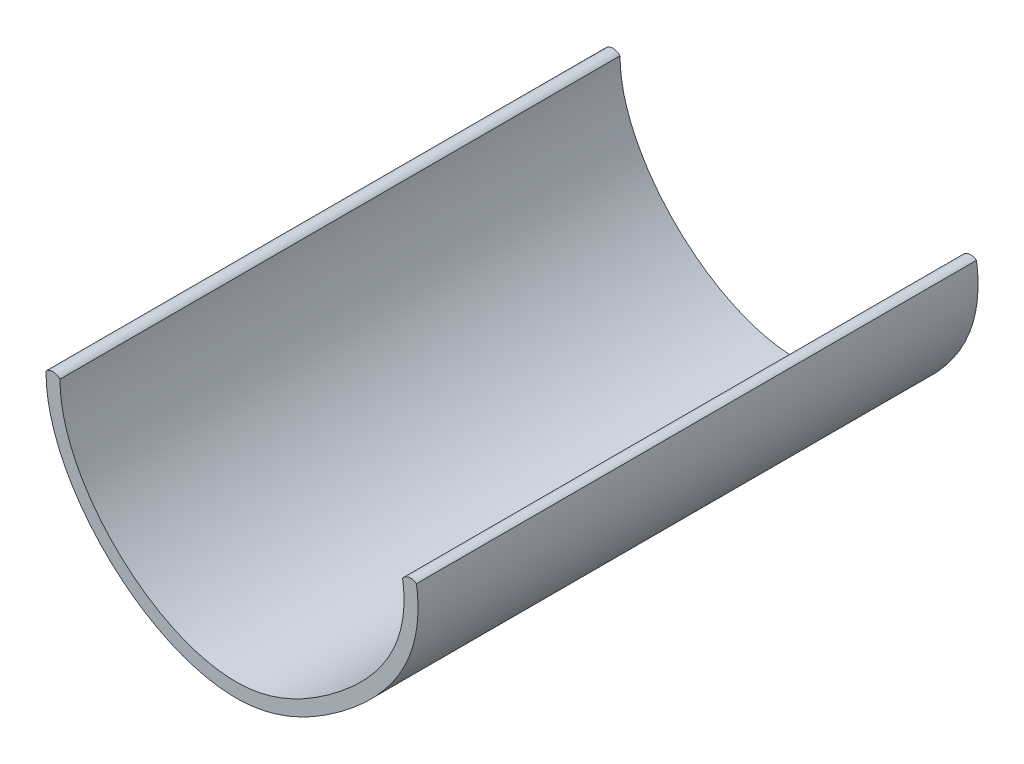
ISO-10303-21;
HEADER;
FILE_DESCRIPTION(('STEP AP214'),'2;1');
FILE_NAME('part.step','',(''),(''),'','','');
FILE_SCHEMA(('AUTOMOTIVE_DESIGN { 1 0 10303 214 1 1 1 1 }'));
ENDSEC;
DATA;
#1=APPLICATION_CONTEXT('core data for automotive mechanical design processes');
#2=APPLICATION_PROTOCOL_DEFINITION('international standard','automotive_design',2000,#1);
#3=PRODUCT_CONTEXT('',#1,'mechanical');
#4=PRODUCT('Part','Part','',(#3));
#5=PRODUCT_RELATED_PRODUCT_CATEGORY('part','',(#4));
#6=PRODUCT_DEFINITION_FORMATION('','',#4);
#7=PRODUCT_DEFINITION_CONTEXT('part definition',#1,'design');
#8=PRODUCT_DEFINITION('design','',#6,#7);
#9=PRODUCT_DEFINITION_SHAPE('','',#8);
#10=(LENGTH_UNIT() NAMED_UNIT(*) SI_UNIT(.MILLI.,.METRE.));
#11=(NAMED_UNIT(*) PLANE_ANGLE_UNIT() SI_UNIT($,.RADIAN.));
#12=(NAMED_UNIT(*) SI_UNIT($,.STERADIAN.) SOLID_ANGLE_UNIT());
#13=UNCERTAINTY_MEASURE_WITH_UNIT(LENGTH_MEASURE(1.E-05),#10,'distance_accuracy_value','');
#14=(GEOMETRIC_REPRESENTATION_CONTEXT(3) GLOBAL_UNCERTAINTY_ASSIGNED_CONTEXT((#13)) GLOBAL_UNIT_ASSIGNED_CONTEXT((#10,
#11,#12)) REPRESENTATION_CONTEXT('',''));
#15=CARTESIAN_POINT('',(0.,0.,0.));
#16=DIRECTION('',(0.,0.,1.));
#17=DIRECTION('',(1.,0.,0.));
#18=AXIS2_PLACEMENT_3D('',#15,#16,#17);
#19=CARTESIAN_POINT('',(-53.9458792130575,0.0161390405231305,160.));
#20=CARTESIAN_POINT('',(-53.9728372771176,-3.32447916920619,160.));
#21=CARTESIAN_POINT('',(-53.1169197391425,-9.97210813956946,160.));
#22=CARTESIAN_POINT('',(-48.3186257412113,-22.9476999731037,160.));
#23=CARTESIAN_POINT('',(-37.4977810954608,-37.6557960795774,160.));
#24=CARTESIAN_POINT('',(-22.5369827321518,-48.2889658051953,160.));
#25=CARTESIAN_POINT('',(-9.35297820489991,-52.9780975265847,160.));
#26=CARTESIAN_POINT('',(-0.875167080412836,-54.0072326889111,160.));
#27=CARTESIAN_POINT('',(5.88420344258249,-53.4737669759108,160.));
#28=CARTESIAN_POINT('',(12.495566088701,-52.0193173768353,160.));
#29=CARTESIAN_POINT('',(20.412937664188,-48.750122664442,160.));
#30=CARTESIAN_POINT('',(29.2163138320214,-43.1744173587522,160.));
#31=CARTESIAN_POINT('',(37.2556199118436,-36.6657466850767,160.));
#32=CARTESIAN_POINT('',(44.2264496344875,-29.1983564609291,160.));
#33=CARTESIAN_POINT('',(48.6223971087403,-22.0474809606801,160.));
#34=CARTESIAN_POINT('',(50.9830227572088,-15.7278012700219,160.));
#35=CARTESIAN_POINT('',(52.0925349916324,-10.6910470314013,160.));
#36=CARTESIAN_POINT('',(52.4010363149379,-6.2431917660797,160.));
#37=CARTESIAN_POINT('',(52.2468069212184,-2.55989558369466,160.));
#38=CARTESIAN_POINT('',(52.0257770110246,-0.643260947069359,160.));
#39=CARTESIAN_POINT('',(51.883290662586,0.299026980879101,160.));
#40=B_SPLINE_CURVE_WITH_KNOTS('',3,(#19,#20,#21,#22,#23,#24,#25,#26,#27,#28,#29,#30,#31,#32,#33,
#34,#35,#36,#37,#38,#39),.UNSPECIFIED.,.F.,.F.,(4,1,1,1,1,1,1,1,1,1,1,1,1,1,1,1,1,1,4),(0.,
0.0625,0.125,0.25,0.375,0.4375,0.5,0.53125,0.5625,0.625,0.6875,0.75,0.8125,0.875,0.90625,0.9375,
0.96875,0.984375,1.),.UNSPECIFIED.);
#41=DIRECTION('',(0.,0.,-1.));
#42=VECTOR('',#41,1.);
#43=SURFACE_OF_LINEAR_EXTRUSION('',#40,#42);
#44=CARTESIAN_POINT('',(-53.9458792130575,0.0161390405231305,0.));
#45=CARTESIAN_POINT('',(-53.9728372771176,-3.32447916920619,0.));
#46=CARTESIAN_POINT('',(-53.1169197391425,-9.97210813956946,0.));
#47=CARTESIAN_POINT('',(-48.3186257412113,-22.9476999731037,0.));
#48=CARTESIAN_POINT('',(-37.4977810954608,-37.6557960795774,0.));
#49=CARTESIAN_POINT('',(-22.5369827321518,-48.2889658051953,0.));
#50=CARTESIAN_POINT('',(-9.35297820489991,-52.9780975265847,0.));
#51=CARTESIAN_POINT('',(-0.875167080412836,-54.0072326889111,0.));
#52=CARTESIAN_POINT('',(5.88420344258249,-53.4737669759108,0.));
#53=CARTESIAN_POINT('',(12.495566088701,-52.0193173768353,0.));
#54=CARTESIAN_POINT('',(20.412937664188,-48.750122664442,0.));
#55=CARTESIAN_POINT('',(29.2163138320214,-43.1744173587522,0.));
#56=CARTESIAN_POINT('',(37.2556199118436,-36.6657466850767,0.));
#57=CARTESIAN_POINT('',(44.2264496344875,-29.1983564609291,0.));
#58=CARTESIAN_POINT('',(48.6223971087403,-22.0474809606801,0.));
#59=CARTESIAN_POINT('',(50.9830227572088,-15.7278012700219,0.));
#60=CARTESIAN_POINT('',(52.0925349916324,-10.6910470314013,0.));
#61=CARTESIAN_POINT('',(52.4010363149379,-6.2431917660797,0.));
#62=CARTESIAN_POINT('',(52.2468069212184,-2.55989558369466,0.));
#63=CARTESIAN_POINT('',(52.0257770110246,-0.643260947069359,0.));
#64=CARTESIAN_POINT('',(51.883290662586,0.299026980879101,0.));
#65=B_SPLINE_CURVE_WITH_KNOTS('',3,(#44,#45,#46,#47,#48,#49,#50,#51,#52,#53,#54,#55,#56,#57,#58,
#59,#60,#61,#62,#63,#64),.UNSPECIFIED.,.F.,.F.,(4,1,1,1,1,1,1,1,1,1,1,1,1,1,1,1,1,1,4),(0.,
0.0625,0.125,0.25,0.375,0.4375,0.5,0.53125,0.5625,0.625,0.6875,0.75,0.8125,0.875,0.90625,0.9375,
0.96875,0.984375,1.),.UNSPECIFIED.);
#66=CARTESIAN_POINT('',(-53.9458792130575,0.0161390405231318,0.));
#67=VERTEX_POINT('',#66);
#68=CARTESIAN_POINT('',(51.883290662586,0.2990269808791,0.));
#69=VERTEX_POINT('',#68);
#70=EDGE_CURVE('E116',#67,#69,#65,.T.);
#71=ORIENTED_EDGE('',*,*,#70,.T.);
#72=DIRECTION('',(0.,0.,-1.));
#73=VECTOR('',#72,1.);
#74=CARTESIAN_POINT('',(51.883290662586,0.2990269808791,160.));
#75=LINE('',#74,#73);
#76=CARTESIAN_POINT('',(51.883290662586,0.2990269808791,160.));
#77=VERTEX_POINT('',#76);
#78=EDGE_CURVE('E11',#77,#69,#75,.T.);
#79=ORIENTED_EDGE('',*,*,#78,.F.);
#80=CARTESIAN_POINT('',(-53.9458792130575,0.0161390405231318,160.));
#81=VERTEX_POINT('',#80);
#82=EDGE_CURVE('E85',#81,#77,#40,.T.);
#83=ORIENTED_EDGE('',*,*,#82,.F.);
#84=DIRECTION('',(0.,0.,-1.));
#85=VECTOR('',#84,1.);
#86=CARTESIAN_POINT('',(-53.9458792130575,0.0161390405231318,160.));
#87=LINE('',#86,#85);
#88=EDGE_CURVE('E93',#81,#67,#87,.T.);
#89=ORIENTED_EDGE('',*,*,#88,.T.);
#90=EDGE_LOOP('',(#71,#79,#83,#89));
#91=FACE_BOUND('',#90,.T.);
#92=ADVANCED_FACE('F33',(#91),#43,.F.);
#93=CARTESIAN_POINT('',(50.2047982719529,-1.97751937151229,160.));
#94=DIRECTION('',(0.,0.,-1.));
#95=DIRECTION('',(-1.,0.,0.));
#96=AXIS2_PLACEMENT_3D('',#93,#94,#95);
#97=CYLINDRICAL_SURFACE('',#96,2.8284271247462);
#98=CARTESIAN_POINT('',(50.2047982719529,-1.97751937151229,0.));
#99=DIRECTION('',(0.,0.,1.));
#100=DIRECTION('',(1.,0.,0.));
#101=AXIS2_PLACEMENT_3D('',#98,#99,#100);
#102=CIRCLE('',#101,2.8284271247462);
#103=CARTESIAN_POINT('',(47.9282519195615,-0.2990269808791,0.));
#104=VERTEX_POINT('',#103);
#105=EDGE_CURVE('E89',#69,#104,#102,.T.);
#106=ORIENTED_EDGE('',*,*,#105,.T.);
#107=DIRECTION('',(0.,0.,-1.));
#108=VECTOR('',#107,1.);
#109=CARTESIAN_POINT('',(47.9282519195615,-0.2990269808791,160.));
#110=LINE('',#109,#108);
#111=CARTESIAN_POINT('',(47.9282519195615,-0.2990269808791,160.));
#112=VERTEX_POINT('',#111);
#113=EDGE_CURVE('E42',#112,#104,#110,.T.);
#114=ORIENTED_EDGE('',*,*,#113,.F.);
#115=CARTESIAN_POINT('',(50.2047982719529,-1.97751937151229,160.));
#116=DIRECTION('',(0.,0.,1.));
#117=DIRECTION('',(1.,0.,0.));
#118=AXIS2_PLACEMENT_3D('',#115,#116,#117);
#119=CIRCLE('',#118,2.8284271247462);
#120=EDGE_CURVE('E80',#77,#112,#119,.T.);
#121=ORIENTED_EDGE('',*,*,#120,.F.);
#122=ORIENTED_EDGE('',*,*,#78,.T.);
#123=EDGE_LOOP('',(#106,#114,#121,#122));
#124=FACE_BOUND('',#123,.T.);
#125=ADVANCED_FACE('F88',(#124),#97,.T.);
#126=CARTESIAN_POINT('',(47.9282519195615,-0.299026980879101,160.));
#127=CARTESIAN_POINT('',(48.0565380332933,-1.14740619487159,160.));
#128=CARTESIAN_POINT('',(48.255945865111,-2.87692506175413,160.));
#129=CARTESIAN_POINT('',(48.3931920867555,-6.16966804369663,160.));
#130=CARTESIAN_POINT('',(48.1184819172362,-10.1214914860022,160.));
#131=CARTESIAN_POINT('',(47.134803167472,-14.5879541962331,160.));
#132=CARTESIAN_POINT('',(45.0312256620008,-20.2257942748311,160.));
#133=CARTESIAN_POINT('',(41.0485006582265,-26.7249619131409,160.));
#134=CARTESIAN_POINT('',(34.5570033027371,-33.6975870077957,160.));
#135=CARTESIAN_POINT('',(26.8551275261533,-39.9359843201061,160.));
#136=CARTESIAN_POINT('',(18.528840903893,-45.1981754956068,160.));
#137=CARTESIAN_POINT('',(9.76451809995502,-48.8119913495424,160.));
#138=CARTESIAN_POINT('',(0.809088458335742,-50.1740477135519,160.));
#139=CARTESIAN_POINT('',(-8.39784542531392,-49.0581878681569,160.));
#140=CARTESIAN_POINT('',(-20.5646312113137,-44.7473293016711,160.));
#141=CARTESIAN_POINT('',(-31.8337528340813,-36.7569005397196,160.));
#142=CARTESIAN_POINT('',(-40.7466676635166,-26.4535588780411,160.));
#143=CARTESIAN_POINT('',(-45.9062438897834,-17.9296627917126,160.));
#144=CARTESIAN_POINT('',(-48.6577771361517,-10.4759940056276,160.));
#145=CARTESIAN_POINT('',(-49.7794457909959,-4.47117694600204,160.));
#146=CARTESIAN_POINT('',(-49.9580390699342,-1.50683841029244,160.));
#147=CARTESIAN_POINT('',(-49.9460094494922,-0.0161390405231305,160.));
#148=B_SPLINE_CURVE_WITH_KNOTS('',3,(#126,#127,#128,#129,#130,#131,#132,#133,#134,#135,#136,
#137,#138,#139,#140,#141,#142,#143,#144,#145,#146,#147),.UNSPECIFIED.,.F.,.F.,(4,1,1,1,1,1,1,1,
1,1,1,1,1,1,1,1,1,1,1,4),(0.,0.015625,0.03125,0.0625,0.09375,0.125,0.1875,0.25,0.3125,0.375,
0.4375,0.5,0.5625,0.625,0.75,0.8125,0.875,0.9375,0.96875,1.),.UNSPECIFIED.);
#149=DIRECTION('',(0.,0.,-1.));
#150=VECTOR('',#149,1.);
#151=SURFACE_OF_LINEAR_EXTRUSION('',#148,#150);
#152=CARTESIAN_POINT('',(47.9282519195615,-0.299026980879101,0.));
#153=CARTESIAN_POINT('',(48.0565380332933,-1.14740619487159,0.));
#154=CARTESIAN_POINT('',(48.255945865111,-2.87692506175413,0.));
#155=CARTESIAN_POINT('',(48.3931920867555,-6.16966804369663,0.));
#156=CARTESIAN_POINT('',(48.1184819172362,-10.1214914860022,0.));
#157=CARTESIAN_POINT('',(47.134803167472,-14.5879541962331,0.));
#158=CARTESIAN_POINT('',(45.0312256620008,-20.2257942748311,0.));
#159=CARTESIAN_POINT('',(41.0485006582265,-26.7249619131409,0.));
#160=CARTESIAN_POINT('',(34.5570033027371,-33.6975870077957,0.));
#161=CARTESIAN_POINT('',(26.8551275261533,-39.9359843201061,0.));
#162=CARTESIAN_POINT('',(18.528840903893,-45.1981754956068,0.));
#163=CARTESIAN_POINT('',(9.76451809995502,-48.8119913495424,0.));
#164=CARTESIAN_POINT('',(0.809088458335742,-50.1740477135519,0.));
#165=CARTESIAN_POINT('',(-8.39784542531392,-49.0581878681569,0.));
#166=CARTESIAN_POINT('',(-20.5646312113137,-44.7473293016711,0.));
#167=CARTESIAN_POINT('',(-31.8337528340813,-36.7569005397196,0.));
#168=CARTESIAN_POINT('',(-40.7466676635166,-26.4535588780411,0.));
#169=CARTESIAN_POINT('',(-45.9062438897834,-17.9296627917126,0.));
#170=CARTESIAN_POINT('',(-48.6577771361517,-10.4759940056276,0.));
#171=CARTESIAN_POINT('',(-49.7794457909959,-4.47117694600204,0.));
#172=CARTESIAN_POINT('',(-49.9580390699342,-1.50683841029244,0.));
#173=CARTESIAN_POINT('',(-49.9460094494922,-0.0161390405231305,0.));
#174=B_SPLINE_CURVE_WITH_KNOTS('',3,(#152,#153,#154,#155,#156,#157,#158,#159,#160,#161,#162,
#163,#164,#165,#166,#167,#168,#169,#170,#171,#172,#173),.UNSPECIFIED.,.F.,.F.,(4,1,1,1,1,1,1,1,
1,1,1,1,1,1,1,1,1,1,1,4),(0.,0.015625,0.03125,0.0625,0.09375,0.125,0.1875,0.25,0.3125,0.375,
0.4375,0.5,0.5625,0.625,0.75,0.8125,0.875,0.9375,0.96875,1.),.UNSPECIFIED.);
#175=CARTESIAN_POINT('',(-49.9460094494922,-0.0161390405231305,0.));
#176=VERTEX_POINT('',#175);
#177=EDGE_CURVE('E67',#104,#176,#174,.T.);
#178=ORIENTED_EDGE('',*,*,#177,.T.);
#179=DIRECTION('',(0.,0.,-1.));
#180=VECTOR('',#179,1.);
#181=CARTESIAN_POINT('',(-49.9460094494922,-0.0161390405231305,160.));
#182=LINE('',#181,#180);
#183=CARTESIAN_POINT('',(-49.9460094494922,-0.0161390405231305,160.));
#184=VERTEX_POINT('',#183);
#185=EDGE_CURVE('E90',#184,#176,#182,.T.);
#186=ORIENTED_EDGE('',*,*,#185,.F.);
#187=EDGE_CURVE('E83',#112,#184,#148,.T.);
#188=ORIENTED_EDGE('',*,*,#187,.F.);
#189=ORIENTED_EDGE('',*,*,#113,.T.);
#190=EDGE_LOOP('',(#178,#186,#188,#189));
#191=FACE_BOUND('',#190,.T.);
#192=ADVANCED_FACE('F91',(#191),#151,.F.);
#193=CARTESIAN_POINT('',(-51.962083371798,-1.99993488178267,160.));
#194=DIRECTION('',(0.,0.,-1.));
#195=DIRECTION('',(-1.,0.,0.));
#196=AXIS2_PLACEMENT_3D('',#193,#194,#195);
#197=CYLINDRICAL_SURFACE('',#196,2.8284271247462);
#198=CARTESIAN_POINT('',(-51.962083371798,-1.99993488178267,0.));
#199=DIRECTION('',(0.,0.,1.));
#200=DIRECTION('',(1.,0.,0.));
#201=AXIS2_PLACEMENT_3D('',#198,#199,#200);
#202=CIRCLE('',#201,2.8284271247462);
#203=EDGE_CURVE('E73',#176,#67,#202,.T.);
#204=ORIENTED_EDGE('',*,*,#203,.T.);
#205=ORIENTED_EDGE('',*,*,#88,.F.);
#206=CARTESIAN_POINT('',(-51.962083371798,-1.99993488178267,160.));
#207=DIRECTION('',(0.,0.,1.));
#208=DIRECTION('',(1.,0.,0.));
#209=AXIS2_PLACEMENT_3D('',#206,#207,#208);
#210=CIRCLE('',#209,2.8284271247462);
#211=EDGE_CURVE('E50',#184,#81,#210,.T.);
#212=ORIENTED_EDGE('',*,*,#211,.F.);
#213=ORIENTED_EDGE('',*,*,#185,.T.);
#214=EDGE_LOOP('',(#204,#205,#212,#213));
#215=FACE_BOUND('',#214,.T.);
#216=ADVANCED_FACE('F105',(#215),#197,.T.);
#217=CARTESIAN_POINT('',(0.812769018953135,-53.7608017737559,160.));
#218=DIRECTION('',(0.,0.,-1.));
#219=DIRECTION('',(-1.,0.,0.));
#220=AXIS2_PLACEMENT_3D('',#217,#218,#219);
#221=PLANE('',#220);
#222=ORIENTED_EDGE('',*,*,#82,.T.);
#223=ORIENTED_EDGE('',*,*,#120,.T.);
#224=ORIENTED_EDGE('',*,*,#187,.T.);
#225=ORIENTED_EDGE('',*,*,#211,.T.);
#226=EDGE_LOOP('',(#222,#223,#224,#225));
#227=FACE_BOUND('',#226,.T.);
#228=ADVANCED_FACE('F81',(#227),#221,.F.);
#229=CARTESIAN_POINT('',(0.812769018953135,-53.7608017737559,0.));
#230=DIRECTION('',(0.,0.,-1.));
#231=DIRECTION('',(-1.,0.,0.));
#232=AXIS2_PLACEMENT_3D('',#229,#230,#231);
#233=PLANE('',#232);
#234=ORIENTED_EDGE('',*,*,#70,.F.);
#235=ORIENTED_EDGE('',*,*,#203,.F.);
#236=ORIENTED_EDGE('',*,*,#177,.F.);
#237=ORIENTED_EDGE('',*,*,#105,.F.);
#238=EDGE_LOOP('',(#234,#235,#236,#237));
#239=FACE_BOUND('',#238,.T.);
#240=ADVANCED_FACE('F133',(#239),#233,.T.);
#241=CLOSED_SHELL('',(#92,#125,#192,#216,#228,#240));
#242=MANIFOLD_SOLID_BREP('B2',#241);
#243=ADVANCED_BREP_SHAPE_REPRESENTATION('',(#18,#242),#14);
#244=SHAPE_DEFINITION_REPRESENTATION(#9,#243);
ENDSEC;
END-ISO-10303-21;
